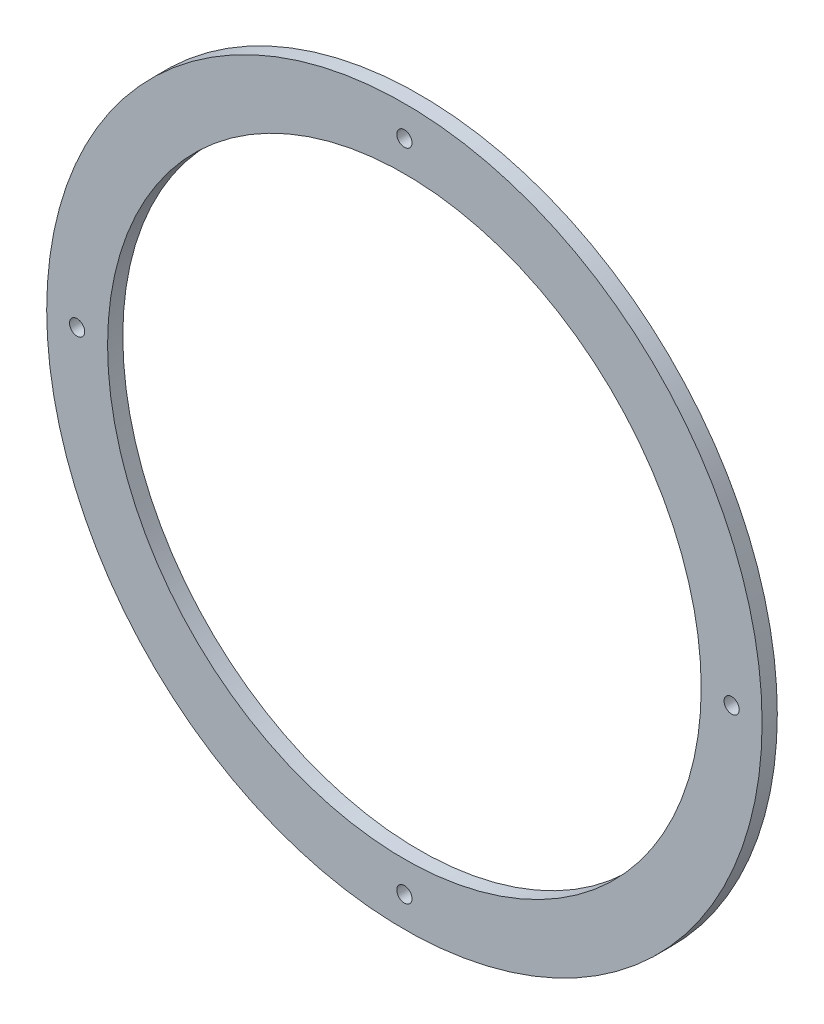
ISO-10303-21;
HEADER;
FILE_DESCRIPTION(('STEP AP214'),'2;1');
FILE_NAME('part.step','',(''),(''),'','','');
FILE_SCHEMA(('AUTOMOTIVE_DESIGN { 1 0 10303 214 1 1 1 1 }'));
ENDSEC;
DATA;
#1=APPLICATION_CONTEXT('core data for automotive mechanical design processes');
#2=APPLICATION_PROTOCOL_DEFINITION('international standard','automotive_design',2000,#1);
#3=PRODUCT_CONTEXT('',#1,'mechanical');
#4=PRODUCT('Part','Part','',(#3));
#5=PRODUCT_RELATED_PRODUCT_CATEGORY('part','',(#4));
#6=PRODUCT_DEFINITION_FORMATION('','',#4);
#7=PRODUCT_DEFINITION_CONTEXT('part definition',#1,'design');
#8=PRODUCT_DEFINITION('design','',#6,#7);
#9=PRODUCT_DEFINITION_SHAPE('','',#8);
#10=(LENGTH_UNIT() NAMED_UNIT(*) SI_UNIT(.MILLI.,.METRE.));
#11=(NAMED_UNIT(*) PLANE_ANGLE_UNIT() SI_UNIT($,.RADIAN.));
#12=(NAMED_UNIT(*) SI_UNIT($,.STERADIAN.) SOLID_ANGLE_UNIT());
#13=UNCERTAINTY_MEASURE_WITH_UNIT(LENGTH_MEASURE(1.E-05),#10,'distance_accuracy_value','');
#14=(GEOMETRIC_REPRESENTATION_CONTEXT(3) GLOBAL_UNCERTAINTY_ASSIGNED_CONTEXT((#13)) GLOBAL_UNIT_ASSIGNED_CONTEXT((#10,
#11,#12)) REPRESENTATION_CONTEXT('',''));
#15=CARTESIAN_POINT('',(0.,0.,0.));
#16=DIRECTION('',(0.,0.,1.));
#17=DIRECTION('',(1.,0.,0.));
#18=AXIS2_PLACEMENT_3D('',#15,#16,#17);
#19=CARTESIAN_POINT('',(0.,0.,6.35));
#20=DIRECTION('',(0.,0.,1.));
#21=DIRECTION('',(1.,0.,0.));
#22=AXIS2_PLACEMENT_3D('',#19,#20,#21);
#23=PLANE('',#22);
#24=CARTESIAN_POINT('',(3.55513069888109E-12,-136.525,6.35));
#25=DIRECTION('',(0.,0.,1.));
#26=DIRECTION('',(1.,0.,0.));
#27=AXIS2_PLACEMENT_3D('',#24,#25,#26);
#28=CIRCLE('',#27,3.175);
#29=CARTESIAN_POINT('',(3.17500000000355,-136.525,6.35));
#30=VERTEX_POINT('',#29);
#31=EDGE_CURVE('E63',#30,#30,#28,.T.);
#32=ORIENTED_EDGE('',*,*,#31,.F.);
#33=EDGE_LOOP('',(#32));
#34=FACE_BOUND('',#33,.T.);
#35=CARTESIAN_POINT('',(0.,136.525,6.35));
#36=DIRECTION('',(0.,0.,1.));
#37=DIRECTION('',(1.,0.,0.));
#38=AXIS2_PLACEMENT_3D('',#35,#36,#37);
#39=CIRCLE('',#38,3.175);
#40=CARTESIAN_POINT('',(3.175,136.525,6.35));
#41=VERTEX_POINT('',#40);
#42=EDGE_CURVE('E51',#41,#41,#39,.T.);
#43=ORIENTED_EDGE('',*,*,#42,.F.);
#44=EDGE_LOOP('',(#43));
#45=FACE_BOUND('',#44,.T.);
#46=CARTESIAN_POINT('',(0.,0.,6.35));
#47=DIRECTION('',(0.,0.,1.));
#48=DIRECTION('',(1.,0.,0.));
#49=AXIS2_PLACEMENT_3D('',#46,#47,#48);
#50=CIRCLE('',#49,149.225);
#51=CARTESIAN_POINT('',(149.225,0.,6.35));
#52=VERTEX_POINT('',#51);
#53=EDGE_CURVE('E10',#52,#52,#50,.T.);
#54=ORIENTED_EDGE('',*,*,#53,.T.);
#55=EDGE_LOOP('',(#54));
#56=FACE_BOUND('',#55,.T.);
#57=CARTESIAN_POINT('',(0.,0.,6.35));
#58=DIRECTION('',(0.,0.,1.));
#59=DIRECTION('',(1.,0.,0.));
#60=AXIS2_PLACEMENT_3D('',#57,#58,#59);
#61=CIRCLE('',#60,123.825);
#62=CARTESIAN_POINT('',(123.825,0.,6.35));
#63=VERTEX_POINT('',#62);
#64=EDGE_CURVE('E46',#63,#63,#61,.T.);
#65=ORIENTED_EDGE('',*,*,#64,.F.);
#66=EDGE_LOOP('',(#65));
#67=FACE_BOUND('',#66,.T.);
#68=CARTESIAN_POINT('',(136.525000000002,1.77756534944054E-12,6.35));
#69=DIRECTION('',(0.,0.,1.));
#70=DIRECTION('',(1.,0.,0.));
#71=AXIS2_PLACEMENT_3D('',#68,#69,#70);
#72=CIRCLE('',#71,3.175);
#73=CARTESIAN_POINT('',(139.700000000002,1.77756534944054E-12,6.35));
#74=VERTEX_POINT('',#73);
#75=EDGE_CURVE('E57',#74,#74,#72,.T.);
#76=ORIENTED_EDGE('',*,*,#75,.F.);
#77=EDGE_LOOP('',(#76));
#78=FACE_BOUND('',#77,.T.);
#79=CARTESIAN_POINT('',(-136.524999999998,-1.7942848398659E-12,6.35));
#80=DIRECTION('',(0.,0.,1.));
#81=DIRECTION('',(1.,0.,0.));
#82=AXIS2_PLACEMENT_3D('',#79,#80,#81);
#83=CIRCLE('',#82,3.175);
#84=CARTESIAN_POINT('',(-133.349999999998,-1.7942848398659E-12,6.35));
#85=VERTEX_POINT('',#84);
#86=EDGE_CURVE('E69',#85,#85,#83,.T.);
#87=ORIENTED_EDGE('',*,*,#86,.F.);
#88=EDGE_LOOP('',(#87));
#89=FACE_BOUND('',#88,.T.);
#90=ADVANCED_FACE('F35',(#34,#45,#56,#67,#78,#89),#23,.T.);
#91=CARTESIAN_POINT('',(0.,0.,0.));
#92=DIRECTION('',(0.,0.,1.));
#93=DIRECTION('',(1.,0.,0.));
#94=AXIS2_PLACEMENT_3D('',#91,#92,#93);
#95=PLANE('',#94);
#96=CARTESIAN_POINT('',(0.,0.,0.));
#97=DIRECTION('',(0.,0.,1.));
#98=DIRECTION('',(1.,0.,0.));
#99=AXIS2_PLACEMENT_3D('',#96,#97,#98);
#100=CIRCLE('',#99,149.225);
#101=CARTESIAN_POINT('',(149.225,0.,0.));
#102=VERTEX_POINT('',#101);
#103=EDGE_CURVE('E39',#102,#102,#100,.T.);
#104=ORIENTED_EDGE('',*,*,#103,.F.);
#105=EDGE_LOOP('',(#104));
#106=FACE_BOUND('',#105,.T.);
#107=CARTESIAN_POINT('',(0.,0.,0.));
#108=DIRECTION('',(0.,0.,1.));
#109=DIRECTION('',(1.,0.,0.));
#110=AXIS2_PLACEMENT_3D('',#107,#108,#109);
#111=CIRCLE('',#110,123.825);
#112=CARTESIAN_POINT('',(123.825,0.,0.));
#113=VERTEX_POINT('',#112);
#114=EDGE_CURVE('E48',#113,#113,#111,.T.);
#115=ORIENTED_EDGE('',*,*,#114,.T.);
#116=EDGE_LOOP('',(#115));
#117=FACE_BOUND('',#116,.T.);
#118=CARTESIAN_POINT('',(0.,136.525,0.));
#119=DIRECTION('',(0.,0.,1.));
#120=DIRECTION('',(1.,0.,0.));
#121=AXIS2_PLACEMENT_3D('',#118,#119,#120);
#122=CIRCLE('',#121,3.175);
#123=CARTESIAN_POINT('',(3.175,136.525,0.));
#124=VERTEX_POINT('',#123);
#125=EDGE_CURVE('E54',#124,#124,#122,.T.);
#126=ORIENTED_EDGE('',*,*,#125,.T.);
#127=EDGE_LOOP('',(#126));
#128=FACE_BOUND('',#127,.T.);
#129=CARTESIAN_POINT('',(136.525000000002,1.77756534944054E-12,0.));
#130=DIRECTION('',(0.,0.,1.));
#131=DIRECTION('',(1.,0.,0.));
#132=AXIS2_PLACEMENT_3D('',#129,#130,#131);
#133=CIRCLE('',#132,3.175);
#134=CARTESIAN_POINT('',(139.700000000002,1.77756534944054E-12,0.));
#135=VERTEX_POINT('',#134);
#136=EDGE_CURVE('E60',#135,#135,#133,.T.);
#137=ORIENTED_EDGE('',*,*,#136,.T.);
#138=EDGE_LOOP('',(#137));
#139=FACE_BOUND('',#138,.T.);
#140=CARTESIAN_POINT('',(3.55513069888109E-12,-136.525,0.));
#141=DIRECTION('',(0.,0.,1.));
#142=DIRECTION('',(1.,0.,0.));
#143=AXIS2_PLACEMENT_3D('',#140,#141,#142);
#144=CIRCLE('',#143,3.175);
#145=CARTESIAN_POINT('',(3.17500000000355,-136.525,0.));
#146=VERTEX_POINT('',#145);
#147=EDGE_CURVE('E66',#146,#146,#144,.T.);
#148=ORIENTED_EDGE('',*,*,#147,.T.);
#149=EDGE_LOOP('',(#148));
#150=FACE_BOUND('',#149,.T.);
#151=CARTESIAN_POINT('',(-136.524999999998,-1.7942848398659E-12,0.));
#152=DIRECTION('',(0.,0.,1.));
#153=DIRECTION('',(1.,0.,0.));
#154=AXIS2_PLACEMENT_3D('',#151,#152,#153);
#155=CIRCLE('',#154,3.175);
#156=CARTESIAN_POINT('',(-133.349999999998,-1.7942848398659E-12,0.));
#157=VERTEX_POINT('',#156);
#158=EDGE_CURVE('E72',#157,#157,#155,.T.);
#159=ORIENTED_EDGE('',*,*,#158,.T.);
#160=EDGE_LOOP('',(#159));
#161=FACE_BOUND('',#160,.T.);
#162=ADVANCED_FACE('F82',(#106,#117,#128,#139,#150,#161),#95,.F.);
#163=CARTESIAN_POINT('',(0.,0.,6.35));
#164=DIRECTION('',(0.,0.,-1.));
#165=DIRECTION('',(-1.,0.,0.));
#166=AXIS2_PLACEMENT_3D('',#163,#164,#165);
#167=CYLINDRICAL_SURFACE('',#166,149.225);
#168=ORIENTED_EDGE('',*,*,#53,.F.);
#169=EDGE_LOOP('',(#168));
#170=FACE_BOUND('',#169,.T.);
#171=ORIENTED_EDGE('',*,*,#103,.T.);
#172=EDGE_LOOP('',(#171));
#173=FACE_BOUND('',#172,.T.);
#174=ADVANCED_FACE('F37',(#170,#173),#167,.T.);
#175=CARTESIAN_POINT('',(0.,0.,6.35));
#176=DIRECTION('',(0.,0.,-1.));
#177=DIRECTION('',(-1.,0.,0.));
#178=AXIS2_PLACEMENT_3D('',#175,#176,#177);
#179=CYLINDRICAL_SURFACE('',#178,123.825);
#180=ORIENTED_EDGE('',*,*,#64,.T.);
#181=EDGE_LOOP('',(#180));
#182=FACE_BOUND('',#181,.T.);
#183=ORIENTED_EDGE('',*,*,#114,.F.);
#184=EDGE_LOOP('',(#183));
#185=FACE_BOUND('',#184,.T.);
#186=ADVANCED_FACE('F92',(#182,#185),#179,.F.);
#187=CARTESIAN_POINT('',(0.,136.525,6.35));
#188=DIRECTION('',(0.,0.,-1.));
#189=DIRECTION('',(-1.,0.,0.));
#190=AXIS2_PLACEMENT_3D('',#187,#188,#189);
#191=CYLINDRICAL_SURFACE('',#190,3.175);
#192=ORIENTED_EDGE('',*,*,#42,.T.);
#193=EDGE_LOOP('',(#192));
#194=FACE_BOUND('',#193,.T.);
#195=ORIENTED_EDGE('',*,*,#125,.F.);
#196=EDGE_LOOP('',(#195));
#197=FACE_BOUND('',#196,.T.);
#198=ADVANCED_FACE('F95',(#194,#197),#191,.F.);
#199=CARTESIAN_POINT('',(136.525000000002,1.77756534944054E-12,6.35));
#200=DIRECTION('',(0.,0.,-1.));
#201=DIRECTION('',(-1.,0.,0.));
#202=AXIS2_PLACEMENT_3D('',#199,#200,#201);
#203=CYLINDRICAL_SURFACE('',#202,3.175);
#204=ORIENTED_EDGE('',*,*,#75,.T.);
#205=EDGE_LOOP('',(#204));
#206=FACE_BOUND('',#205,.T.);
#207=ORIENTED_EDGE('',*,*,#136,.F.);
#208=EDGE_LOOP('',(#207));
#209=FACE_BOUND('',#208,.T.);
#210=ADVANCED_FACE('F99',(#206,#209),#203,.F.);
#211=CARTESIAN_POINT('',(3.55513069888109E-12,-136.525,6.35));
#212=DIRECTION('',(0.,0.,-1.));
#213=DIRECTION('',(-1.,0.,0.));
#214=AXIS2_PLACEMENT_3D('',#211,#212,#213);
#215=CYLINDRICAL_SURFACE('',#214,3.175);
#216=ORIENTED_EDGE('',*,*,#31,.T.);
#217=EDGE_LOOP('',(#216));
#218=FACE_BOUND('',#217,.T.);
#219=ORIENTED_EDGE('',*,*,#147,.F.);
#220=EDGE_LOOP('',(#219));
#221=FACE_BOUND('',#220,.T.);
#222=ADVANCED_FACE('F103',(#218,#221),#215,.F.);
#223=CARTESIAN_POINT('',(-136.524999999998,-1.7942848398659E-12,6.35));
#224=DIRECTION('',(0.,0.,-1.));
#225=DIRECTION('',(-1.,0.,0.));
#226=AXIS2_PLACEMENT_3D('',#223,#224,#225);
#227=CYLINDRICAL_SURFACE('',#226,3.175);
#228=ORIENTED_EDGE('',*,*,#86,.T.);
#229=EDGE_LOOP('',(#228));
#230=FACE_BOUND('',#229,.T.);
#231=ORIENTED_EDGE('',*,*,#158,.F.);
#232=EDGE_LOOP('',(#231));
#233=FACE_BOUND('',#232,.T.);
#234=ADVANCED_FACE('F78',(#230,#233),#227,.F.);
#235=CLOSED_SHELL('',(#90,#162,#174,#186,#198,#210,#222,#234));
#236=MANIFOLD_SOLID_BREP('B2',#235);
#237=ADVANCED_BREP_SHAPE_REPRESENTATION('',(#18,#236),#14);
#238=SHAPE_DEFINITION_REPRESENTATION(#9,#237);
ENDSEC;
END-ISO-10303-21;
